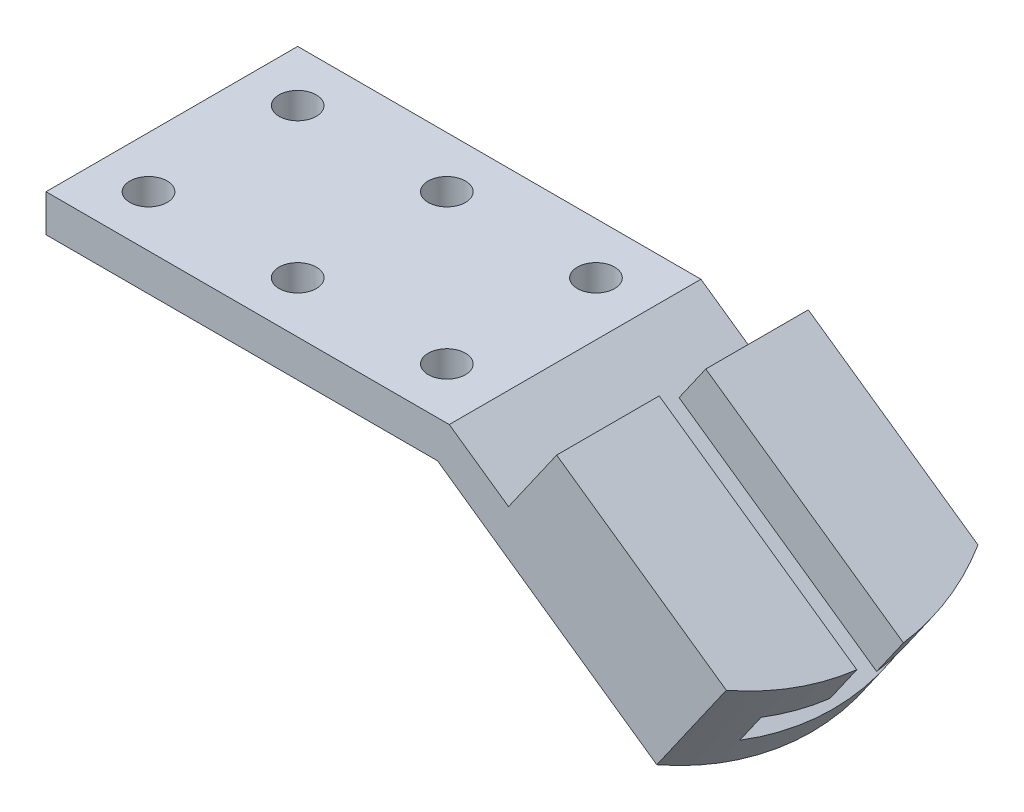
ISO-10303-21;
HEADER;
FILE_DESCRIPTION(('STEP AP214'),'2;1');
FILE_NAME('part.step','',(''),(''),'','','');
FILE_SCHEMA(('AUTOMOTIVE_DESIGN { 1 0 10303 214 1 1 1 1 }'));
ENDSEC;
DATA;
#1=APPLICATION_CONTEXT('core data for automotive mechanical design processes');
#2=APPLICATION_PROTOCOL_DEFINITION('international standard','automotive_design',2000,#1);
#3=PRODUCT_CONTEXT('',#1,'mechanical');
#4=PRODUCT('Part','Part','',(#3));
#5=PRODUCT_RELATED_PRODUCT_CATEGORY('part','',(#4));
#6=PRODUCT_DEFINITION_FORMATION('','',#4);
#7=PRODUCT_DEFINITION_CONTEXT('part definition',#1,'design');
#8=PRODUCT_DEFINITION('design','',#6,#7);
#9=PRODUCT_DEFINITION_SHAPE('','',#8);
#10=(LENGTH_UNIT() NAMED_UNIT(*) SI_UNIT(.MILLI.,.METRE.));
#11=(NAMED_UNIT(*) PLANE_ANGLE_UNIT() SI_UNIT($,.RADIAN.));
#12=(NAMED_UNIT(*) SI_UNIT($,.STERADIAN.) SOLID_ANGLE_UNIT());
#13=UNCERTAINTY_MEASURE_WITH_UNIT(LENGTH_MEASURE(1.E-05),#10,'distance_accuracy_value','');
#14=(GEOMETRIC_REPRESENTATION_CONTEXT(3) GLOBAL_UNCERTAINTY_ASSIGNED_CONTEXT((#13)) GLOBAL_UNIT_ASSIGNED_CONTEXT((#10,
#11,#12)) REPRESENTATION_CONTEXT('',''));
#15=CARTESIAN_POINT('',(0.,0.,0.));
#16=DIRECTION('',(0.,0.,1.));
#17=DIRECTION('',(1.,0.,0.));
#18=AXIS2_PLACEMENT_3D('',#15,#16,#17);
#19=CARTESIAN_POINT('',(0.,0.,27.));
#20=DIRECTION('',(0.,0.,1.));
#21=DIRECTION('',(1.,0.,0.));
#22=AXIS2_PLACEMENT_3D('',#19,#20,#21);
#23=PLANE('',#22);
#24=DIRECTION('',(0.819152044288993,-0.573576436351044,0.));
#25=VECTOR('',#24,1.);
#26=CARTESIAN_POINT('',(84.,0.,27.));
#27=LINE('',#26,#25);
#28=CARTESIAN_POINT('',(84.,0.,27.));
#29=VERTEX_POINT('',#28);
#30=CARTESIAN_POINT('',(131.052889710667,-32.9467880699592,27.));
#31=VERTEX_POINT('',#30);
#32=EDGE_CURVE('E227',#29,#31,#27,.T.);
#33=ORIENTED_EDGE('',*,*,#32,.T.);
#34=DIRECTION('',(0.573576436351044,0.819152044288993,0.));
#35=VECTOR('',#34,1.);
#36=CARTESIAN_POINT('',(85.8999066914949,-97.4319307672511,27.));
#37=LINE('',#36,#35);
#38=CARTESIAN_POINT('',(145.965877055794,-11.6488349184453,27.));
#39=VERTEX_POINT('',#38);
#40=EDGE_CURVE('E346',#31,#39,#37,.T.);
#41=ORIENTED_EDGE('',*,*,#40,.T.);
#42=DIRECTION('',(-0.819152044288994,0.573576436351044,0.));
#43=VECTOR('',#42,1.);
#44=CARTESIAN_POINT('',(152.157870223912,-15.984515211304,27.));
#45=LINE('',#44,#43);
#46=CARTESIAN_POINT('',(109.561963920884,13.8414594789502,27.));
#47=VERTEX_POINT('',#46);
#48=EDGE_CURVE('E232',#39,#47,#45,.T.);
#49=ORIENTED_EDGE('',*,*,#48,.T.);
#50=DIRECTION('',(-0.573576436351043,-0.819152044288994,0.));
#51=VECTOR('',#50,1.);
#52=CARTESIAN_POINT('',(109.561963920884,13.8414594789502,27.));
#53=LINE('',#52,#51);
#54=CARTESIAN_POINT('',(99.2375880665653,-0.903277318251623,27.));
#55=VERTEX_POINT('',#54);
#56=EDGE_CURVE('E231',#47,#55,#53,.T.);
#57=ORIENTED_EDGE('',*,*,#56,.T.);
#58=DIRECTION('',(-0.819152044288994,0.573576436351043,0.));
#59=VECTOR('',#58,1.);
#60=CARTESIAN_POINT('',(99.2375880665653,-0.903277318251623,27.));
#61=LINE('',#60,#59);
#62=CARTESIAN_POINT('',(86.5223903110318,8.,27.));
#63=VERTEX_POINT('',#62);
#64=EDGE_CURVE('E240',#55,#63,#61,.T.);
#65=ORIENTED_EDGE('',*,*,#64,.T.);
#66=DIRECTION('',(-1.,0.,0.));
#67=VECTOR('',#66,1.);
#68=CARTESIAN_POINT('',(86.5223903110318,8.,27.));
#69=LINE('',#68,#67);
#70=CARTESIAN_POINT('',(0.,7.99999999999999,27.));
#71=VERTEX_POINT('',#70);
#72=EDGE_CURVE('E239',#63,#71,#69,.T.);
#73=ORIENTED_EDGE('',*,*,#72,.T.);
#74=DIRECTION('',(0.,-1.,0.));
#75=VECTOR('',#74,1.);
#76=CARTESIAN_POINT('',(0.,7.99999999999999,27.));
#77=LINE('',#76,#75);
#78=CARTESIAN_POINT('',(0.,0.,27.));
#79=VERTEX_POINT('',#78);
#80=EDGE_CURVE('E221',#71,#79,#77,.T.);
#81=ORIENTED_EDGE('',*,*,#80,.T.);
#82=DIRECTION('',(1.,0.,0.));
#83=VECTOR('',#82,1.);
#84=CARTESIAN_POINT('',(0.,0.,27.));
#85=LINE('',#84,#83);
#86=EDGE_CURVE('E226',#79,#29,#85,.T.);
#87=ORIENTED_EDGE('',*,*,#86,.T.);
#88=EDGE_LOOP('',(#33,#41,#49,#57,#65,#73,#81,#87));
#89=FACE_BOUND('',#88,.T.);
#90=ADVANCED_FACE('F39',(#89),#23,.T.);
#91=CARTESIAN_POINT('',(99.2375880665653,-0.903277318251623,27.));
#92=DIRECTION('',(-0.573576436351043,-0.819152044288994,0.));
#93=DIRECTION('',(0.819152044288994,-0.573576436351043,0.));
#94=AXIS2_PLACEMENT_3D('',#91,#92,#93);
#95=PLANE('',#94);
#96=DIRECTION('',(0.819152044288994,-0.573576436351043,0.));
#97=VECTOR('',#96,1.);
#98=CARTESIAN_POINT('',(25.7192659481096,50.5748060256203,17.5));
#99=LINE('',#98,#97);
#100=CARTESIAN_POINT('',(99.2375880665653,-0.90327731825162,17.5));
#101=VERTEX_POINT('',#100);
#102=CARTESIAN_POINT('',(139.348863281018,-28.9894945906155,17.5));
#103=VERTEX_POINT('',#102);
#104=EDGE_CURVE('E159',#101,#103,#99,.T.);
#105=ORIENTED_EDGE('',*,*,#104,.T.);
#106=CARTESIAN_POINT('',(99.2375880665653,-0.903277318251614,0.));
#107=DIRECTION('',(-0.573576436351043,-0.819152044288994,0.));
#108=DIRECTION('',(0.819152044288994,-0.573576436351043,0.));
#109=AXIS2_PLACEMENT_3D('',#106,#107,#108);
#110=CIRCLE('',#109,52.);
#111=CARTESIAN_POINT('',(139.348863281018,-28.9894945906155,-17.5));
#112=VERTEX_POINT('',#111);
#113=EDGE_CURVE('E149',#103,#112,#110,.F.);
#114=ORIENTED_EDGE('',*,*,#113,.T.);
#115=DIRECTION('',(0.819152044288994,-0.573576436351043,0.));
#116=VECTOR('',#115,1.);
#117=CARTESIAN_POINT('',(25.7192659481096,50.5748060256203,-17.5));
#118=LINE('',#117,#116);
#119=CARTESIAN_POINT('',(99.2375880665653,-0.903277318251627,-17.5));
#120=VERTEX_POINT('',#119);
#121=EDGE_CURVE('E171',#120,#112,#118,.T.);
#122=ORIENTED_EDGE('',*,*,#121,.F.);
#123=DIRECTION('',(0.,0.,-1.));
#124=VECTOR('',#123,1.);
#125=CARTESIAN_POINT('',(99.2375880665653,-0.903277318251623,27.));
#126=LINE('',#125,#124);
#127=CARTESIAN_POINT('',(99.2375880665653,-0.903277318251623,-27.));
#128=VERTEX_POINT('',#127);
#129=EDGE_CURVE('E265',#120,#128,#126,.T.);
#130=ORIENTED_EDGE('',*,*,#129,.T.);
#131=DIRECTION('',(-0.819152044288994,0.573576436351043,0.));
#132=VECTOR('',#131,1.);
#133=CARTESIAN_POINT('',(99.2375880665653,-0.903277318251623,-27.));
#134=LINE('',#133,#132);
#135=CARTESIAN_POINT('',(86.5223903110318,8.,-27.));
#136=VERTEX_POINT('',#135);
#137=EDGE_CURVE('E255',#128,#136,#134,.T.);
#138=ORIENTED_EDGE('',*,*,#137,.T.);
#139=DIRECTION('',(0.,0.,-1.));
#140=VECTOR('',#139,1.);
#141=CARTESIAN_POINT('',(86.5223903110318,8.,27.));
#142=LINE('',#141,#140);
#143=EDGE_CURVE('E259',#63,#136,#142,.T.);
#144=ORIENTED_EDGE('',*,*,#143,.F.);
#145=ORIENTED_EDGE('',*,*,#64,.F.);
#146=EDGE_CURVE('E174',#55,#101,#126,.T.);
#147=ORIENTED_EDGE('',*,*,#146,.T.);
#148=EDGE_LOOP('',(#105,#114,#122,#130,#138,#144,#145,#147));
#149=FACE_BOUND('',#148,.T.);
#150=ADVANCED_FACE('F169',(#149),#95,.F.);
#151=CARTESIAN_POINT('',(25.7192659481096,50.5748060256203,17.5));
#152=DIRECTION('',(0.,0.,1.));
#153=DIRECTION('',(1.,0.,0.));
#154=AXIS2_PLACEMENT_3D('',#151,#152,#153);
#155=PLANE('',#154);
#156=DIRECTION('',(0.573576436351044,0.819152044288993,0.));
#157=VECTOR('',#156,1.);
#158=CARTESIAN_POINT('',(89.6072687710372,-100.027853642219,17.5));
#159=LINE('',#158,#157);
#160=CARTESIAN_POINT('',(143.937474771826,-22.4362782363036,17.5));
#161=VERTEX_POINT('',#160);
#162=EDGE_CURVE('E53',#161,#103,#159,.F.);
#163=ORIENTED_EDGE('',*,*,#162,.T.);
#164=ORIENTED_EDGE('',*,*,#104,.F.);
#165=DIRECTION('',(0.573576436351043,0.819152044288994,0.));
#166=VECTOR('',#165,1.);
#167=CARTESIAN_POINT('',(99.2375880665653,-0.903277318251676,17.5));
#168=LINE('',#167,#166);
#169=CARTESIAN_POINT('',(103.826199557374,5.64993903606026,17.5));
#170=VERTEX_POINT('',#169);
#171=EDGE_CURVE('E290',#101,#170,#168,.T.);
#172=ORIENTED_EDGE('',*,*,#171,.T.);
#173=DIRECTION('',(0.819152044288994,-0.573576436351043,0.));
#174=VECTOR('',#173,1.);
#175=CARTESIAN_POINT('',(30.3078774389179,57.1280223799322,17.5));
#176=LINE('',#175,#174);
#177=EDGE_CURVE('E162',#170,#161,#176,.T.);
#178=ORIENTED_EDGE('',*,*,#177,.T.);
#179=EDGE_LOOP('',(#163,#164,#172,#178));
#180=FACE_BOUND('',#179,.T.);
#181=ADVANCED_FACE('F157',(#180),#155,.F.);
#182=CARTESIAN_POINT('',(30.3078774389179,57.1280223799322,17.5));
#183=DIRECTION('',(0.573576436351043,0.819152044288994,0.));
#184=DIRECTION('',(-0.819152044288994,0.573576436351043,0.));
#185=AXIS2_PLACEMENT_3D('',#182,#183,#184);
#186=PLANE('',#185);
#187=CARTESIAN_POINT('',(103.826199557374,5.6499390360603,0.));
#188=DIRECTION('',(0.573576436351043,0.819152044288994,0.));
#189=DIRECTION('',(-0.819152044288994,0.573576436351043,0.));
#190=AXIS2_PLACEMENT_3D('',#187,#188,#189);
#191=CIRCLE('',#190,52.);
#192=CARTESIAN_POINT('',(146.224737055556,-24.0378365292335,5.));
#193=VERTEX_POINT('',#192);
#194=EDGE_CURVE('E164',#193,#161,#191,.F.);
#195=ORIENTED_EDGE('',*,*,#194,.T.);
#196=ORIENTED_EDGE('',*,*,#177,.F.);
#197=DIRECTION('',(0.,0.,-1.));
#198=VECTOR('',#197,1.);
#199=CARTESIAN_POINT('',(103.826199557374,5.64993903606026,17.5));
#200=LINE('',#199,#198);
#201=CARTESIAN_POINT('',(103.826199557374,5.64993903606026,5.));
#202=VERTEX_POINT('',#201);
#203=EDGE_CURVE('E181',#170,#202,#200,.T.);
#204=ORIENTED_EDGE('',*,*,#203,.T.);
#205=DIRECTION('',(0.819152044288994,-0.573576436351043,0.));
#206=VECTOR('',#205,1.);
#207=CARTESIAN_POINT('',(30.3078774389179,57.1280223799322,5.));
#208=LINE('',#207,#206);
#209=EDGE_CURVE('E178',#202,#193,#208,.T.);
#210=ORIENTED_EDGE('',*,*,#209,.T.);
#211=EDGE_LOOP('',(#195,#196,#204,#210));
#212=FACE_BOUND('',#211,.T.);
#213=ADVANCED_FACE('F343',(#212),#186,.F.);
#214=CARTESIAN_POINT('',(0.,0.,-27.));
#215=DIRECTION('',(0.,0.,1.));
#216=DIRECTION('',(1.,0.,0.));
#217=AXIS2_PLACEMENT_3D('',#214,#215,#216);
#218=PLANE('',#217);
#219=DIRECTION('',(0.573576436351044,0.819152044288993,0.));
#220=VECTOR('',#219,1.);
#221=CARTESIAN_POINT('',(85.8999066914949,-97.4319307672511,-27.));
#222=LINE('',#221,#220);
#223=CARTESIAN_POINT('',(131.052889710667,-32.9467880699592,-27.));
#224=VERTEX_POINT('',#223);
#225=CARTESIAN_POINT('',(145.965877055794,-11.6488349184453,-27.));
#226=VERTEX_POINT('',#225);
#227=EDGE_CURVE('E154',#224,#226,#222,.T.);
#228=ORIENTED_EDGE('',*,*,#227,.F.);
#229=DIRECTION('',(0.819152044288993,-0.573576436351044,0.));
#230=VECTOR('',#229,1.);
#231=CARTESIAN_POINT('',(84.,0.,-27.));
#232=LINE('',#231,#230);
#233=CARTESIAN_POINT('',(84.,0.,-27.));
#234=VERTEX_POINT('',#233);
#235=EDGE_CURVE('E248',#234,#224,#232,.T.);
#236=ORIENTED_EDGE('',*,*,#235,.F.);
#237=DIRECTION('',(1.,0.,0.));
#238=VECTOR('',#237,1.);
#239=CARTESIAN_POINT('',(0.,0.,-27.));
#240=LINE('',#239,#238);
#241=CARTESIAN_POINT('',(0.,0.,-27.));
#242=VERTEX_POINT('',#241);
#243=EDGE_CURVE('E243',#242,#234,#240,.T.);
#244=ORIENTED_EDGE('',*,*,#243,.F.);
#245=DIRECTION('',(0.,-1.,0.));
#246=VECTOR('',#245,1.);
#247=CARTESIAN_POINT('',(0.,7.99999999999999,-27.));
#248=LINE('',#247,#246);
#249=CARTESIAN_POINT('',(0.,7.99999999999999,-27.));
#250=VERTEX_POINT('',#249);
#251=EDGE_CURVE('E224',#250,#242,#248,.T.);
#252=ORIENTED_EDGE('',*,*,#251,.F.);
#253=DIRECTION('',(-1.,0.,0.));
#254=VECTOR('',#253,1.);
#255=CARTESIAN_POINT('',(86.5223903110318,8.,-27.));
#256=LINE('',#255,#254);
#257=EDGE_CURVE('E230',#136,#250,#256,.T.);
#258=ORIENTED_EDGE('',*,*,#257,.F.);
#259=ORIENTED_EDGE('',*,*,#137,.F.);
#260=DIRECTION('',(-0.573576436351043,-0.819152044288994,0.));
#261=VECTOR('',#260,1.);
#262=CARTESIAN_POINT('',(109.561963920884,13.8414594789502,-27.));
#263=LINE('',#262,#261);
#264=CARTESIAN_POINT('',(109.561963920884,13.8414594789502,-27.));
#265=VERTEX_POINT('',#264);
#266=EDGE_CURVE('E253',#265,#128,#263,.T.);
#267=ORIENTED_EDGE('',*,*,#266,.F.);
#268=DIRECTION('',(-0.819152044288994,0.573576436351044,0.));
#269=VECTOR('',#268,1.);
#270=CARTESIAN_POINT('',(152.157870223912,-15.984515211304,-27.));
#271=LINE('',#270,#269);
#272=EDGE_CURVE('E250',#226,#265,#271,.T.);
#273=ORIENTED_EDGE('',*,*,#272,.F.);
#274=EDGE_LOOP('',(#228,#236,#244,#252,#258,#259,#267,#273));
#275=FACE_BOUND('',#274,.T.);
#276=ADVANCED_FACE('F277',(#275),#218,.F.);
#277=CARTESIAN_POINT('',(30.3078774389179,57.1280223799322,-5.));
#278=DIRECTION('',(0.573576436351043,0.819152044288994,0.));
#279=DIRECTION('',(-0.819152044288994,0.573576436351043,0.));
#280=AXIS2_PLACEMENT_3D('',#277,#278,#279);
#281=PLANE('',#280);
#282=CARTESIAN_POINT('',(103.826199557374,5.6499390360603,0.));
#283=DIRECTION('',(0.573576436351043,0.819152044288994,0.));
#284=DIRECTION('',(-0.819152044288994,0.573576436351043,0.));
#285=AXIS2_PLACEMENT_3D('',#282,#283,#284);
#286=CIRCLE('',#285,52.);
#287=CARTESIAN_POINT('',(143.937474771826,-22.4362782363036,-17.5));
#288=VERTEX_POINT('',#287);
#289=CARTESIAN_POINT('',(146.224737055556,-24.0378365292335,-5.));
#290=VERTEX_POINT('',#289);
#291=EDGE_CURVE('E64',#288,#290,#286,.F.);
#292=ORIENTED_EDGE('',*,*,#291,.T.);
#293=DIRECTION('',(0.819152044288994,-0.573576436351043,0.));
#294=VECTOR('',#293,1.);
#295=CARTESIAN_POINT('',(30.3078774389179,57.1280223799322,-5.));
#296=LINE('',#295,#294);
#297=CARTESIAN_POINT('',(103.826199557374,5.64993903606027,-5.));
#298=VERTEX_POINT('',#297);
#299=EDGE_CURVE('E308',#298,#290,#296,.T.);
#300=ORIENTED_EDGE('',*,*,#299,.F.);
#301=DIRECTION('',(0.,0.,-1.));
#302=VECTOR('',#301,1.);
#303=CARTESIAN_POINT('',(103.826199557374,5.64993903606026,-5.));
#304=LINE('',#303,#302);
#305=CARTESIAN_POINT('',(103.826199557374,5.64993903606025,-17.5));
#306=VERTEX_POINT('',#305);
#307=EDGE_CURVE('E299',#298,#306,#304,.T.);
#308=ORIENTED_EDGE('',*,*,#307,.T.);
#309=DIRECTION('',(0.819152044288994,-0.573576436351043,0.));
#310=VECTOR('',#309,1.);
#311=CARTESIAN_POINT('',(30.3078774389179,57.1280223799322,-17.5));
#312=LINE('',#311,#310);
#313=EDGE_CURVE('E173',#306,#288,#312,.T.);
#314=ORIENTED_EDGE('',*,*,#313,.T.);
#315=EDGE_LOOP('',(#292,#300,#308,#314));
#316=FACE_BOUND('',#315,.T.);
#317=ADVANCED_FACE('F309',(#316),#281,.F.);
#318=CARTESIAN_POINT('',(30.3078774389179,57.1280223799322,-17.5));
#319=DIRECTION('',(0.,0.,-1.));
#320=DIRECTION('',(0.,1.,0.));
#321=AXIS2_PLACEMENT_3D('',#318,#319,#320);
#322=PLANE('',#321);
#323=DIRECTION('',(0.573576436351044,0.819152044288993,0.));
#324=VECTOR('',#323,1.);
#325=CARTESIAN_POINT('',(89.6072687710372,-100.027853642219,-17.5000000000001));
#326=LINE('',#325,#324);
#327=EDGE_CURVE('E151',#112,#288,#326,.T.);
#328=ORIENTED_EDGE('',*,*,#327,.T.);
#329=ORIENTED_EDGE('',*,*,#313,.F.);
#330=DIRECTION('',(-0.573576436351043,-0.819152044288994,0.));
#331=VECTOR('',#330,1.);
#332=CARTESIAN_POINT('',(103.826199557374,5.64993903606022,-17.5));
#333=LINE('',#332,#331);
#334=EDGE_CURVE('E291',#306,#120,#333,.T.);
#335=ORIENTED_EDGE('',*,*,#334,.T.);
#336=ORIENTED_EDGE('',*,*,#121,.T.);
#337=EDGE_LOOP('',(#328,#329,#335,#336));
#338=FACE_BOUND('',#337,.T.);
#339=ADVANCED_FACE('F314',(#338),#322,.F.);
#340=CARTESIAN_POINT('',(152.157870223912,-15.984515211304,27.));
#341=DIRECTION('',(-0.573576436351044,-0.819152044288994,0.));
#342=DIRECTION('',(0.819152044288994,-0.573576436351044,0.));
#343=AXIS2_PLACEMENT_3D('',#340,#341,#342);
#344=PLANE('',#343);
#345=ORIENTED_EDGE('',*,*,#48,.F.);
#346=CARTESIAN_POINT('',(109.561963920884,13.8414594789503,0.));
#347=DIRECTION('',(0.573576436351044,0.819152044288994,0.));
#348=DIRECTION('',(-0.819152044288993,0.573576436351044,0.));
#349=AXIS2_PLACEMENT_3D('',#346,#347,#348);
#350=CIRCLE('',#349,52.);
#351=CARTESIAN_POINT('',(151.960501419066,-15.8463160863436,5.));
#352=VERTEX_POINT('',#351);
#353=EDGE_CURVE('E341',#39,#352,#350,.T.);
#354=ORIENTED_EDGE('',*,*,#353,.T.);
#355=DIRECTION('',(0.819152044288994,-0.573576436351043,0.));
#356=VECTOR('',#355,1.);
#357=CARTESIAN_POINT('',(36.0436418024283,65.3195428228221,5.));
#358=LINE('',#357,#356);
#359=CARTESIAN_POINT('',(109.561963920884,13.8414594789502,5.));
#360=VERTEX_POINT('',#359);
#361=EDGE_CURVE('E186',#360,#352,#358,.T.);
#362=ORIENTED_EDGE('',*,*,#361,.F.);
#363=DIRECTION('',(0.,0.,-1.));
#364=VECTOR('',#363,1.);
#365=CARTESIAN_POINT('',(109.561963920884,13.8414594789502,27.));
#366=LINE('',#365,#364);
#367=EDGE_CURVE('E264',#47,#360,#366,.T.);
#368=ORIENTED_EDGE('',*,*,#367,.F.);
#369=EDGE_LOOP('',(#345,#354,#362,#368));
#370=FACE_BOUND('',#369,.T.);
#371=ADVANCED_FACE('F352',(#370),#344,.F.);
#372=CARTESIAN_POINT('',(109.561963920884,13.8414594789502,27.));
#373=DIRECTION('',(0.819152044288994,-0.573576436351043,0.));
#374=DIRECTION('',(0.573576436351043,0.819152044288994,0.));
#375=AXIS2_PLACEMENT_3D('',#372,#373,#374);
#376=PLANE('',#375);
#377=DIRECTION('',(-0.573576436351043,-0.819152044288994,0.));
#378=VECTOR('',#377,1.);
#379=CARTESIAN_POINT('',(109.561963920884,13.8414594789502,-5.));
#380=LINE('',#379,#378);
#381=CARTESIAN_POINT('',(109.561963920884,13.8414594789502,-5.));
#382=VERTEX_POINT('',#381);
#383=EDGE_CURVE('E185',#382,#298,#380,.T.);
#384=ORIENTED_EDGE('',*,*,#383,.F.);
#385=EDGE_CURVE('E262',#382,#265,#366,.T.);
#386=ORIENTED_EDGE('',*,*,#385,.T.);
#387=ORIENTED_EDGE('',*,*,#266,.T.);
#388=ORIENTED_EDGE('',*,*,#129,.F.);
#389=ORIENTED_EDGE('',*,*,#334,.F.);
#390=ORIENTED_EDGE('',*,*,#307,.F.);
#391=EDGE_LOOP('',(#384,#386,#387,#388,#389,#390));
#392=FACE_BOUND('',#391,.T.);
#393=ADVANCED_FACE('F321',(#392),#376,.F.);
#394=ORIENTED_EDGE('',*,*,#171,.F.);
#395=ORIENTED_EDGE('',*,*,#146,.F.);
#396=ORIENTED_EDGE('',*,*,#56,.F.);
#397=ORIENTED_EDGE('',*,*,#367,.T.);
#398=DIRECTION('',(0.573576436351043,0.819152044288994,0.));
#399=VECTOR('',#398,1.);
#400=CARTESIAN_POINT('',(103.826199557374,5.64993903606022,5.));
#401=LINE('',#400,#399);
#402=EDGE_CURVE('E292',#202,#360,#401,.T.);
#403=ORIENTED_EDGE('',*,*,#402,.F.);
#404=ORIENTED_EDGE('',*,*,#203,.F.);
#405=EDGE_LOOP('',(#394,#395,#396,#397,#403,#404));
#406=FACE_BOUND('',#405,.T.);
#407=ADVANCED_FACE('F336',(#406),#376,.F.);
#408=CARTESIAN_POINT('',(0.,7.99999999999999,27.));
#409=DIRECTION('',(1.,0.,0.));
#410=DIRECTION('',(0.,0.,-1.));
#411=AXIS2_PLACEMENT_3D('',#408,#409,#410);
#412=PLANE('',#411);
#413=ORIENTED_EDGE('',*,*,#251,.T.);
#414=DIRECTION('',(0.,0.,-1.));
#415=VECTOR('',#414,1.);
#416=CARTESIAN_POINT('',(0.,0.,27.));
#417=LINE('',#416,#415);
#418=EDGE_CURVE('E11',#79,#242,#417,.T.);
#419=ORIENTED_EDGE('',*,*,#418,.F.);
#420=ORIENTED_EDGE('',*,*,#80,.F.);
#421=DIRECTION('',(0.,0.,-1.));
#422=VECTOR('',#421,1.);
#423=CARTESIAN_POINT('',(0.,7.99999999999999,27.));
#424=LINE('',#423,#422);
#425=EDGE_CURVE('E244',#71,#250,#424,.T.);
#426=ORIENTED_EDGE('',*,*,#425,.T.);
#427=EDGE_LOOP('',(#413,#419,#420,#426));
#428=FACE_BOUND('',#427,.T.);
#429=ADVANCED_FACE('F41',(#428),#412,.F.);
#430=CARTESIAN_POINT('',(0.,0.,27.));
#431=DIRECTION('',(0.,1.,0.));
#432=DIRECTION('',(0.,0.,1.));
#433=AXIS2_PLACEMENT_3D('',#430,#431,#432);
#434=PLANE('',#433);
#435=CARTESIAN_POINT('',(11.0000000000003,0.,16.));
#436=DIRECTION('',(0.,1.,0.));
#437=DIRECTION('',(0.,0.,1.));
#438=AXIS2_PLACEMENT_3D('',#435,#436,#437);
#439=CIRCLE('',#438,4.);
#440=CARTESIAN_POINT('',(11.0000000000003,0.,20.));
#441=VERTEX_POINT('',#440);
#442=EDGE_CURVE('E189',#441,#441,#439,.F.);
#443=ORIENTED_EDGE('',*,*,#442,.F.);
#444=EDGE_LOOP('',(#443));
#445=FACE_BOUND('',#444,.T.);
#446=CARTESIAN_POINT('',(75.0000000000003,0.,16.));
#447=DIRECTION('',(0.,1.,0.));
#448=DIRECTION('',(0.,0.,1.));
#449=AXIS2_PLACEMENT_3D('',#446,#447,#448);
#450=CIRCLE('',#449,4.00000000000001);
#451=CARTESIAN_POINT('',(75.0000000000003,0.,20.));
#452=VERTEX_POINT('',#451);
#453=EDGE_CURVE('E208',#452,#452,#450,.F.);
#454=ORIENTED_EDGE('',*,*,#453,.F.);
#455=EDGE_LOOP('',(#454));
#456=FACE_BOUND('',#455,.T.);
#457=CARTESIAN_POINT('',(43.0000000000003,0.,16.));
#458=DIRECTION('',(0.,1.,0.));
#459=DIRECTION('',(0.,0.,1.));
#460=AXIS2_PLACEMENT_3D('',#457,#458,#459);
#461=CIRCLE('',#460,4.);
#462=CARTESIAN_POINT('',(43.0000000000003,0.,20.));
#463=VERTEX_POINT('',#462);
#464=EDGE_CURVE('E205',#463,#463,#461,.F.);
#465=ORIENTED_EDGE('',*,*,#464,.F.);
#466=EDGE_LOOP('',(#465));
#467=FACE_BOUND('',#466,.T.);
#468=CARTESIAN_POINT('',(75.,0.,-16.));
#469=DIRECTION('',(0.,1.,0.));
#470=DIRECTION('',(0.,0.,1.));
#471=AXIS2_PLACEMENT_3D('',#468,#469,#470);
#472=CIRCLE('',#471,4.00000000000001);
#473=CARTESIAN_POINT('',(75.,0.,-12.));
#474=VERTEX_POINT('',#473);
#475=EDGE_CURVE('E198',#474,#474,#472,.F.);
#476=ORIENTED_EDGE('',*,*,#475,.F.);
#477=EDGE_LOOP('',(#476));
#478=FACE_BOUND('',#477,.T.);
#479=CARTESIAN_POINT('',(43.,0.,-16.));
#480=DIRECTION('',(0.,1.,0.));
#481=DIRECTION('',(0.,0.,1.));
#482=AXIS2_PLACEMENT_3D('',#479,#480,#481);
#483=CIRCLE('',#482,4.);
#484=CARTESIAN_POINT('',(43.,0.,-12.));
#485=VERTEX_POINT('',#484);
#486=EDGE_CURVE('E190',#485,#485,#483,.F.);
#487=ORIENTED_EDGE('',*,*,#486,.F.);
#488=EDGE_LOOP('',(#487));
#489=FACE_BOUND('',#488,.T.);
#490=CARTESIAN_POINT('',(11.,0.,-16.));
#491=DIRECTION('',(0.,1.,0.));
#492=DIRECTION('',(0.,0.,1.));
#493=AXIS2_PLACEMENT_3D('',#490,#491,#492);
#494=CIRCLE('',#493,4.);
#495=CARTESIAN_POINT('',(11.,0.,-12.));
#496=VERTEX_POINT('',#495);
#497=EDGE_CURVE('E219',#496,#496,#494,.F.);
#498=ORIENTED_EDGE('',*,*,#497,.F.);
#499=EDGE_LOOP('',(#498));
#500=FACE_BOUND('',#499,.T.);
#501=ORIENTED_EDGE('',*,*,#243,.T.);
#502=DIRECTION('',(0.,0.,-1.));
#503=VECTOR('',#502,1.);
#504=CARTESIAN_POINT('',(84.,0.,27.));
#505=LINE('',#504,#503);
#506=EDGE_CURVE('E50',#29,#234,#505,.T.);
#507=ORIENTED_EDGE('',*,*,#506,.F.);
#508=ORIENTED_EDGE('',*,*,#86,.F.);
#509=ORIENTED_EDGE('',*,*,#418,.T.);
#510=EDGE_LOOP('',(#501,#507,#508,#509));
#511=FACE_BOUND('',#510,.T.);
#512=ADVANCED_FACE('F398',(#445,#456,#467,#478,#489,#500,#511),#434,.F.);
#513=CARTESIAN_POINT('',(84.,0.,27.));
#514=DIRECTION('',(0.573576436351044,0.819152044288993,0.));
#515=DIRECTION('',(-0.819152044288993,0.573576436351044,0.));
#516=AXIS2_PLACEMENT_3D('',#513,#514,#515);
#517=PLANE('',#516);
#518=CARTESIAN_POINT('',(94.6489765757569,-7.45649367256356,0.));
#519=DIRECTION('',(0.573576436351044,0.819152044288993,0.));
#520=DIRECTION('',(-0.819152044288993,0.573576436351044,0.));
#521=AXIS2_PLACEMENT_3D('',#518,#519,#520);
#522=CIRCLE('',#521,52.);
#523=EDGE_CURVE('E285',#224,#31,#522,.F.);
#524=ORIENTED_EDGE('',*,*,#523,.T.);
#525=ORIENTED_EDGE('',*,*,#32,.F.);
#526=ORIENTED_EDGE('',*,*,#506,.T.);
#527=ORIENTED_EDGE('',*,*,#235,.T.);
#528=EDGE_LOOP('',(#524,#525,#526,#527));
#529=FACE_BOUND('',#528,.T.);
#530=ADVANCED_FACE('F275',(#529),#517,.F.);
#531=DIRECTION('',(0.819152044288994,-0.573576436351043,0.));
#532=VECTOR('',#531,1.);
#533=CARTESIAN_POINT('',(36.0436418024283,65.3195428228221,-5.));
#534=LINE('',#533,#532);
#535=CARTESIAN_POINT('',(151.960501419066,-15.8463160863436,-5.));
#536=VERTEX_POINT('',#535);
#537=EDGE_CURVE('E302',#382,#536,#534,.T.);
#538=ORIENTED_EDGE('',*,*,#537,.T.);
#539=CARTESIAN_POINT('',(109.561963920884,13.8414594789503,0.));
#540=DIRECTION('',(0.573576436351044,0.819152044288994,0.));
#541=DIRECTION('',(-0.819152044288993,0.573576436351044,0.));
#542=AXIS2_PLACEMENT_3D('',#539,#540,#541);
#543=CIRCLE('',#542,52.);
#544=EDGE_CURVE('E284',#536,#226,#543,.T.);
#545=ORIENTED_EDGE('',*,*,#544,.T.);
#546=ORIENTED_EDGE('',*,*,#272,.T.);
#547=ORIENTED_EDGE('',*,*,#385,.F.);
#548=EDGE_LOOP('',(#538,#545,#546,#547));
#549=FACE_BOUND('',#548,.T.);
#550=ADVANCED_FACE('F389',(#549),#344,.F.);
#551=CARTESIAN_POINT('',(86.5223903110318,8.,27.));
#552=DIRECTION('',(0.,-1.,0.));
#553=DIRECTION('',(1.,0.,0.));
#554=AXIS2_PLACEMENT_3D('',#551,#552,#553);
#555=PLANE('',#554);
#556=CARTESIAN_POINT('',(11.0000000000003,7.99999999999999,16.));
#557=DIRECTION('',(0.,1.,0.));
#558=DIRECTION('',(-1.,0.,0.));
#559=AXIS2_PLACEMENT_3D('',#556,#557,#558);
#560=CIRCLE('',#559,4.);
#561=CARTESIAN_POINT('',(7.00000000000033,7.99999999999999,16.));
#562=VERTEX_POINT('',#561);
#563=EDGE_CURVE('E211',#562,#562,#560,.T.);
#564=ORIENTED_EDGE('',*,*,#563,.F.);
#565=EDGE_LOOP('',(#564));
#566=FACE_BOUND('',#565,.T.);
#567=CARTESIAN_POINT('',(75.0000000000003,8.,16.));
#568=DIRECTION('',(0.,1.,0.));
#569=DIRECTION('',(-1.,0.,0.));
#570=AXIS2_PLACEMENT_3D('',#567,#568,#569);
#571=CIRCLE('',#570,4.00000000000001);
#572=CARTESIAN_POINT('',(71.0000000000003,8.,16.));
#573=VERTEX_POINT('',#572);
#574=EDGE_CURVE('E202',#573,#573,#571,.T.);
#575=ORIENTED_EDGE('',*,*,#574,.F.);
#576=EDGE_LOOP('',(#575));
#577=FACE_BOUND('',#576,.T.);
#578=CARTESIAN_POINT('',(43.0000000000003,7.99999999999999,16.));
#579=DIRECTION('',(0.,1.,0.));
#580=DIRECTION('',(-1.,0.,0.));
#581=AXIS2_PLACEMENT_3D('',#578,#579,#580);
#582=CIRCLE('',#581,4.);
#583=CARTESIAN_POINT('',(39.0000000000003,7.99999999999999,16.));
#584=VERTEX_POINT('',#583);
#585=EDGE_CURVE('E200',#584,#584,#582,.T.);
#586=ORIENTED_EDGE('',*,*,#585,.F.);
#587=EDGE_LOOP('',(#586));
#588=FACE_BOUND('',#587,.T.);
#589=CARTESIAN_POINT('',(75.,8.,-16.));
#590=DIRECTION('',(0.,1.,0.));
#591=DIRECTION('',(-1.,0.,0.));
#592=AXIS2_PLACEMENT_3D('',#589,#590,#591);
#593=CIRCLE('',#592,4.00000000000001);
#594=CARTESIAN_POINT('',(71.,8.,-16.));
#595=VERTEX_POINT('',#594);
#596=EDGE_CURVE('E194',#595,#595,#593,.T.);
#597=ORIENTED_EDGE('',*,*,#596,.F.);
#598=EDGE_LOOP('',(#597));
#599=FACE_BOUND('',#598,.T.);
#600=CARTESIAN_POINT('',(43.,7.99999999999999,-16.));
#601=DIRECTION('',(0.,1.,0.));
#602=DIRECTION('',(-1.,0.,0.));
#603=AXIS2_PLACEMENT_3D('',#600,#601,#602);
#604=CIRCLE('',#603,4.);
#605=CARTESIAN_POINT('',(39.,7.99999999999999,-16.));
#606=VERTEX_POINT('',#605);
#607=EDGE_CURVE('E193',#606,#606,#604,.T.);
#608=ORIENTED_EDGE('',*,*,#607,.F.);
#609=EDGE_LOOP('',(#608));
#610=FACE_BOUND('',#609,.T.);
#611=CARTESIAN_POINT('',(11.,7.99999999999999,-16.));
#612=DIRECTION('',(0.,1.,0.));
#613=DIRECTION('',(-1.,0.,0.));
#614=AXIS2_PLACEMENT_3D('',#611,#612,#613);
#615=CIRCLE('',#614,4.);
#616=CARTESIAN_POINT('',(7.,7.99999999999999,-16.));
#617=VERTEX_POINT('',#616);
#618=EDGE_CURVE('E191',#617,#617,#615,.T.);
#619=ORIENTED_EDGE('',*,*,#618,.F.);
#620=EDGE_LOOP('',(#619));
#621=FACE_BOUND('',#620,.T.);
#622=ORIENTED_EDGE('',*,*,#257,.T.);
#623=ORIENTED_EDGE('',*,*,#425,.F.);
#624=ORIENTED_EDGE('',*,*,#72,.F.);
#625=ORIENTED_EDGE('',*,*,#143,.T.);
#626=EDGE_LOOP('',(#622,#623,#624,#625));
#627=FACE_BOUND('',#626,.T.);
#628=ADVANCED_FACE('F326',(#566,#577,#588,#599,#610,#621,#627),#555,.F.);
#629=CARTESIAN_POINT('',(11.,-37.2834683628179,-16.));
#630=DIRECTION('',(0.,1.,0.));
#631=DIRECTION('',(-1.,0.,0.));
#632=AXIS2_PLACEMENT_3D('',#629,#630,#631);
#633=CYLINDRICAL_SURFACE('',#632,4.);
#634=ORIENTED_EDGE('',*,*,#618,.T.);
#635=EDGE_LOOP('',(#634));
#636=FACE_BOUND('',#635,.T.);
#637=ORIENTED_EDGE('',*,*,#497,.T.);
#638=EDGE_LOOP('',(#637));
#639=FACE_BOUND('',#638,.T.);
#640=ADVANCED_FACE('F383',(#636,#639),#633,.F.);
#641=CARTESIAN_POINT('',(43.,-37.2834683628179,-16.));
#642=DIRECTION('',(0.,1.,0.));
#643=DIRECTION('',(-1.,0.,0.));
#644=AXIS2_PLACEMENT_3D('',#641,#642,#643);
#645=CYLINDRICAL_SURFACE('',#644,4.);
#646=ORIENTED_EDGE('',*,*,#607,.T.);
#647=EDGE_LOOP('',(#646));
#648=FACE_BOUND('',#647,.T.);
#649=ORIENTED_EDGE('',*,*,#486,.T.);
#650=EDGE_LOOP('',(#649));
#651=FACE_BOUND('',#650,.T.);
#652=ADVANCED_FACE('F411',(#648,#651),#645,.F.);
#653=CARTESIAN_POINT('',(75.,-37.2834683628179,-16.));
#654=DIRECTION('',(0.,1.,0.));
#655=DIRECTION('',(-1.,0.,0.));
#656=AXIS2_PLACEMENT_3D('',#653,#654,#655);
#657=CYLINDRICAL_SURFACE('',#656,4.00000000000001);
#658=ORIENTED_EDGE('',*,*,#596,.T.);
#659=EDGE_LOOP('',(#658));
#660=FACE_BOUND('',#659,.T.);
#661=ORIENTED_EDGE('',*,*,#475,.T.);
#662=EDGE_LOOP('',(#661));
#663=FACE_BOUND('',#662,.T.);
#664=ADVANCED_FACE('F419',(#660,#663),#657,.F.);
#665=CARTESIAN_POINT('',(43.0000000000003,-37.2834683628179,16.));
#666=DIRECTION('',(0.,1.,0.));
#667=DIRECTION('',(-1.,0.,0.));
#668=AXIS2_PLACEMENT_3D('',#665,#666,#667);
#669=CYLINDRICAL_SURFACE('',#668,4.);
#670=ORIENTED_EDGE('',*,*,#585,.T.);
#671=EDGE_LOOP('',(#670));
#672=FACE_BOUND('',#671,.T.);
#673=ORIENTED_EDGE('',*,*,#464,.T.);
#674=EDGE_LOOP('',(#673));
#675=FACE_BOUND('',#674,.T.);
#676=ADVANCED_FACE('F430',(#672,#675),#669,.F.);
#677=CARTESIAN_POINT('',(75.0000000000003,-37.2834683628179,16.));
#678=DIRECTION('',(0.,1.,0.));
#679=DIRECTION('',(-1.,0.,0.));
#680=AXIS2_PLACEMENT_3D('',#677,#678,#679);
#681=CYLINDRICAL_SURFACE('',#680,4.00000000000001);
#682=ORIENTED_EDGE('',*,*,#574,.T.);
#683=EDGE_LOOP('',(#682));
#684=FACE_BOUND('',#683,.T.);
#685=ORIENTED_EDGE('',*,*,#453,.T.);
#686=EDGE_LOOP('',(#685));
#687=FACE_BOUND('',#686,.T.);
#688=ADVANCED_FACE('F367',(#684,#687),#681,.F.);
#689=CARTESIAN_POINT('',(11.0000000000003,-37.2834683628179,16.));
#690=DIRECTION('',(0.,1.,0.));
#691=DIRECTION('',(-1.,0.,0.));
#692=AXIS2_PLACEMENT_3D('',#689,#690,#691);
#693=CYLINDRICAL_SURFACE('',#692,4.);
#694=ORIENTED_EDGE('',*,*,#563,.T.);
#695=EDGE_LOOP('',(#694));
#696=FACE_BOUND('',#695,.T.);
#697=ORIENTED_EDGE('',*,*,#442,.T.);
#698=EDGE_LOOP('',(#697));
#699=FACE_BOUND('',#698,.T.);
#700=ADVANCED_FACE('F363',(#696,#699),#693,.F.);
#701=CARTESIAN_POINT('',(30.3078774389179,57.1280223799322,5.));
#702=DIRECTION('',(0.,0.,1.));
#703=DIRECTION('',(0.,-1.,0.));
#704=AXIS2_PLACEMENT_3D('',#701,#702,#703);
#705=PLANE('',#704);
#706=ORIENTED_EDGE('',*,*,#361,.T.);
#707=DIRECTION('',(0.573576436351044,0.819152044288993,0.));
#708=VECTOR('',#707,1.);
#709=CARTESIAN_POINT('',(91.8945310547665,-101.629411935149,5.00000000000001));
#710=LINE('',#709,#708);
#711=EDGE_CURVE('E342',#352,#193,#710,.F.);
#712=ORIENTED_EDGE('',*,*,#711,.T.);
#713=ORIENTED_EDGE('',*,*,#209,.F.);
#714=ORIENTED_EDGE('',*,*,#402,.T.);
#715=EDGE_LOOP('',(#706,#712,#713,#714));
#716=FACE_BOUND('',#715,.T.);
#717=ADVANCED_FACE('F357',(#716),#705,.F.);
#718=CARTESIAN_POINT('',(36.0436418024283,65.3195428228221,-5.));
#719=DIRECTION('',(0.,0.,-1.));
#720=DIRECTION('',(0.,1.,0.));
#721=AXIS2_PLACEMENT_3D('',#718,#719,#720);
#722=PLANE('',#721);
#723=ORIENTED_EDGE('',*,*,#299,.T.);
#724=DIRECTION('',(0.573576436351044,0.819152044288993,0.));
#725=VECTOR('',#724,1.);
#726=CARTESIAN_POINT('',(91.8945310547665,-101.629411935149,-5.00000000000005));
#727=LINE('',#726,#725);
#728=EDGE_CURVE('E163',#290,#536,#727,.T.);
#729=ORIENTED_EDGE('',*,*,#728,.T.);
#730=ORIENTED_EDGE('',*,*,#537,.F.);
#731=ORIENTED_EDGE('',*,*,#383,.T.);
#732=EDGE_LOOP('',(#723,#729,#730,#731));
#733=FACE_BOUND('',#732,.T.);
#734=ADVANCED_FACE('F356',(#733),#722,.F.);
#735=CARTESIAN_POINT('',(49.4959935565845,-71.9416363698556,0.));
#736=DIRECTION('',(0.573576436351044,0.819152044288993,0.));
#737=DIRECTION('',(-0.819152044288994,0.573576436351044,0.));
#738=AXIS2_PLACEMENT_3D('',#735,#736,#737);
#739=CYLINDRICAL_SURFACE('',#738,52.);
#740=ORIENTED_EDGE('',*,*,#113,.F.);
#741=ORIENTED_EDGE('',*,*,#162,.F.);
#742=ORIENTED_EDGE('',*,*,#194,.F.);
#743=ORIENTED_EDGE('',*,*,#711,.F.);
#744=ORIENTED_EDGE('',*,*,#353,.F.);
#745=ORIENTED_EDGE('',*,*,#40,.F.);
#746=ORIENTED_EDGE('',*,*,#523,.F.);
#747=ORIENTED_EDGE('',*,*,#227,.T.);
#748=ORIENTED_EDGE('',*,*,#544,.F.);
#749=ORIENTED_EDGE('',*,*,#728,.F.);
#750=ORIENTED_EDGE('',*,*,#291,.F.);
#751=ORIENTED_EDGE('',*,*,#327,.F.);
#752=EDGE_LOOP('',(#740,#741,#742,#743,#744,#745,#746,#747,#748,#749,#750,#751));
#753=FACE_BOUND('',#752,.T.);
#754=ADVANCED_FACE('F147',(#753),#739,.T.);
#755=CLOSED_SHELL('',(#90,#150,#181,#213,#276,#317,#339,#371,#393,#407,#429,#512,#530,#550,#628,
#640,#652,#664,#676,#688,#700,#717,#734,#754));
#756=MANIFOLD_SOLID_BREP('B2',#755);
#757=ADVANCED_BREP_SHAPE_REPRESENTATION('',(#18,#756),#14);
#758=SHAPE_DEFINITION_REPRESENTATION(#9,#757);
ENDSEC;
END-ISO-10303-21;
